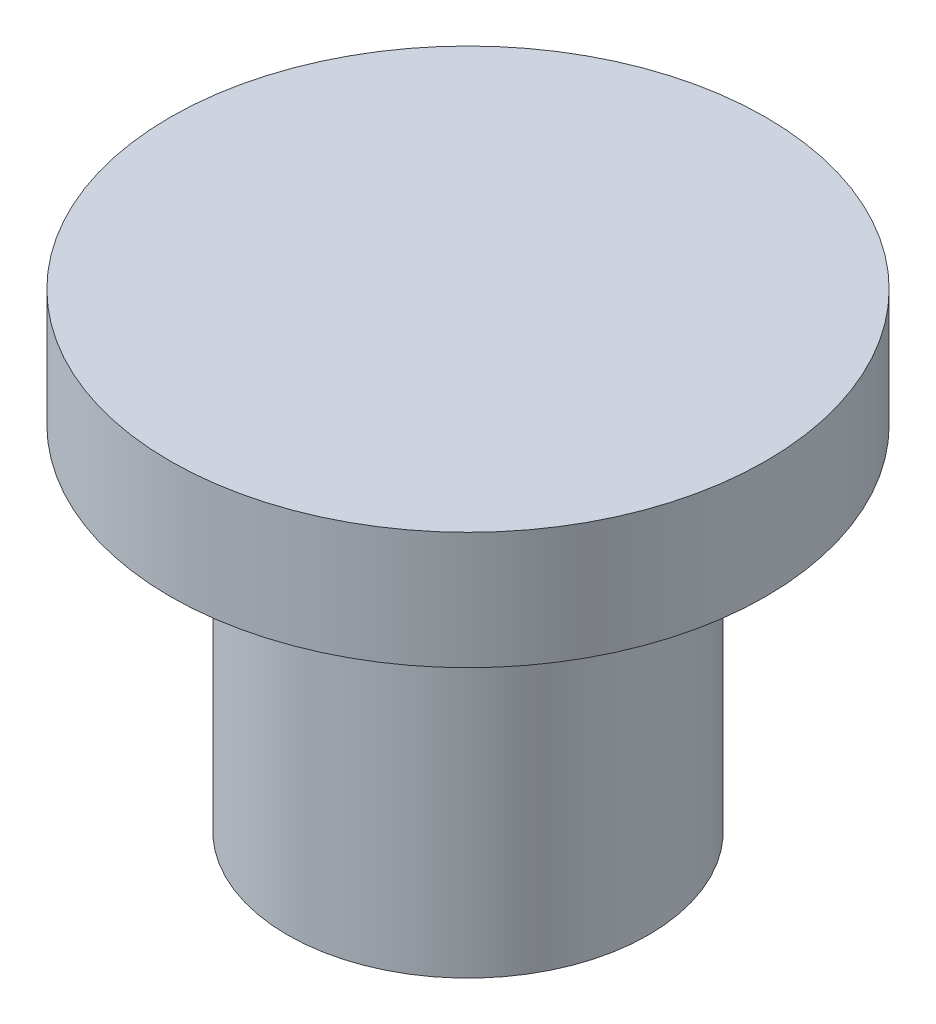
ISO-10303-21;
HEADER;
FILE_DESCRIPTION(('STEP AP214'),'2;1');
FILE_NAME('part.step','',(''),(''),'','','');
FILE_SCHEMA(('AUTOMOTIVE_DESIGN { 1 0 10303 214 1 1 1 1 }'));
ENDSEC;
DATA;
#1=APPLICATION_CONTEXT('core data for automotive mechanical design processes');
#2=APPLICATION_PROTOCOL_DEFINITION('international standard','automotive_design',2000,#1);
#3=PRODUCT_CONTEXT('',#1,'mechanical');
#4=PRODUCT('Part','Part','',(#3));
#5=PRODUCT_RELATED_PRODUCT_CATEGORY('part','',(#4));
#6=PRODUCT_DEFINITION_FORMATION('','',#4);
#7=PRODUCT_DEFINITION_CONTEXT('part definition',#1,'design');
#8=PRODUCT_DEFINITION('design','',#6,#7);
#9=PRODUCT_DEFINITION_SHAPE('','',#8);
#10=(LENGTH_UNIT() NAMED_UNIT(*) SI_UNIT(.MILLI.,.METRE.));
#11=(NAMED_UNIT(*) PLANE_ANGLE_UNIT() SI_UNIT($,.RADIAN.));
#12=(NAMED_UNIT(*) SI_UNIT($,.STERADIAN.) SOLID_ANGLE_UNIT());
#13=UNCERTAINTY_MEASURE_WITH_UNIT(LENGTH_MEASURE(1.E-05),#10,'distance_accuracy_value','');
#14=(GEOMETRIC_REPRESENTATION_CONTEXT(3) GLOBAL_UNCERTAINTY_ASSIGNED_CONTEXT((#13)) GLOBAL_UNIT_ASSIGNED_CONTEXT((#10,
#11,#12)) REPRESENTATION_CONTEXT('',''));
#15=CARTESIAN_POINT('',(0.,0.,0.));
#16=DIRECTION('',(0.,0.,1.));
#17=DIRECTION('',(1.,0.,0.));
#18=AXIS2_PLACEMENT_3D('',#15,#16,#17);
#19=CARTESIAN_POINT('',(0.,0.,0.));
#20=DIRECTION('',(0.,-1.,0.));
#21=DIRECTION('',(0.,0.,-1.));
#22=AXIS2_PLACEMENT_3D('',#19,#20,#21);
#23=CYLINDRICAL_SURFACE('',#22,12.7);
#24=CARTESIAN_POINT('',(0.,15.,0.));
#25=DIRECTION('',(0.,-1.,0.));
#26=DIRECTION('',(0.,0.,-1.));
#27=AXIS2_PLACEMENT_3D('',#24,#25,#26);
#28=CIRCLE('',#27,12.7);
#29=CARTESIAN_POINT('',(0.,15.,-12.7));
#30=VERTEX_POINT('',#29);
#31=EDGE_CURVE('E44',#30,#30,#28,.T.);
#32=ORIENTED_EDGE('',*,*,#31,.F.);
#33=EDGE_LOOP('',(#32));
#34=FACE_BOUND('',#33,.T.);
#35=CARTESIAN_POINT('',(0.,20.,0.));
#36=DIRECTION('',(0.,-1.,0.));
#37=DIRECTION('',(0.,0.,-1.));
#38=AXIS2_PLACEMENT_3D('',#35,#36,#37);
#39=CIRCLE('',#38,12.7);
#40=CARTESIAN_POINT('',(0.,20.,-12.7));
#41=VERTEX_POINT('',#40);
#42=EDGE_CURVE('E10',#41,#41,#39,.T.);
#43=ORIENTED_EDGE('',*,*,#42,.T.);
#44=EDGE_LOOP('',(#43));
#45=FACE_BOUND('',#44,.T.);
#46=ADVANCED_FACE('F33',(#34,#45),#23,.T.);
#47=CARTESIAN_POINT('',(0.,20.,0.));
#48=DIRECTION('',(0.,1.,0.));
#49=DIRECTION('',(0.,0.,1.));
#50=AXIS2_PLACEMENT_3D('',#47,#48,#49);
#51=PLANE('',#50);
#52=ORIENTED_EDGE('',*,*,#42,.F.);
#53=EDGE_LOOP('',(#52));
#54=FACE_BOUND('',#53,.T.);
#55=ADVANCED_FACE('F58',(#54),#51,.T.);
#56=CARTESIAN_POINT('',(0.,0.,0.));
#57=DIRECTION('',(0.,-1.,0.));
#58=DIRECTION('',(0.,0.,-1.));
#59=AXIS2_PLACEMENT_3D('',#56,#57,#58);
#60=CYLINDRICAL_SURFACE('',#59,7.7);
#61=CARTESIAN_POINT('',(0.,0.,0.));
#62=DIRECTION('',(0.,-1.,0.));
#63=DIRECTION('',(0.,0.,-1.));
#64=AXIS2_PLACEMENT_3D('',#61,#62,#63);
#65=CIRCLE('',#64,7.7);
#66=CARTESIAN_POINT('',(0.,0.,-7.7));
#67=VERTEX_POINT('',#66);
#68=EDGE_CURVE('E48',#67,#67,#65,.T.);
#69=ORIENTED_EDGE('',*,*,#68,.F.);
#70=EDGE_LOOP('',(#69));
#71=FACE_BOUND('',#70,.T.);
#72=CARTESIAN_POINT('',(0.,15.,0.));
#73=DIRECTION('',(0.,-1.,0.));
#74=DIRECTION('',(0.,0.,-1.));
#75=AXIS2_PLACEMENT_3D('',#72,#73,#74);
#76=CIRCLE('',#75,7.7);
#77=CARTESIAN_POINT('',(0.,15.,-7.7));
#78=VERTEX_POINT('',#77);
#79=EDGE_CURVE('E40',#78,#78,#76,.T.);
#80=ORIENTED_EDGE('',*,*,#79,.T.);
#81=EDGE_LOOP('',(#80));
#82=FACE_BOUND('',#81,.T.);
#83=ADVANCED_FACE('F55',(#71,#82),#60,.T.);
#84=CARTESIAN_POINT('',(7.7,15.,0.));
#85=DIRECTION('',(0.,1.,0.));
#86=DIRECTION('',(0.,0.,1.));
#87=AXIS2_PLACEMENT_3D('',#84,#85,#86);
#88=PLANE('',#87);
#89=ORIENTED_EDGE('',*,*,#79,.F.);
#90=EDGE_LOOP('',(#89));
#91=FACE_BOUND('',#90,.T.);
#92=ORIENTED_EDGE('',*,*,#31,.T.);
#93=EDGE_LOOP('',(#92));
#94=FACE_BOUND('',#93,.T.);
#95=ADVANCED_FACE('F57',(#91,#94),#88,.F.);
#96=CARTESIAN_POINT('',(0.,0.,0.));
#97=DIRECTION('',(0.,-1.,0.));
#98=DIRECTION('',(0.,0.,-1.));
#99=AXIS2_PLACEMENT_3D('',#96,#97,#98);
#100=PLANE('',#99);
#101=ORIENTED_EDGE('',*,*,#68,.T.);
#102=EDGE_LOOP('',(#101));
#103=FACE_BOUND('',#102,.T.);
#104=ADVANCED_FACE('F35',(#103),#100,.T.);
#105=CLOSED_SHELL('',(#46,#55,#83,#95,#104));
#106=MANIFOLD_SOLID_BREP('B2',#105);
#107=ADVANCED_BREP_SHAPE_REPRESENTATION('',(#18,#106),#14);
#108=SHAPE_DEFINITION_REPRESENTATION(#9,#107);
ENDSEC;
END-ISO-10303-21;
